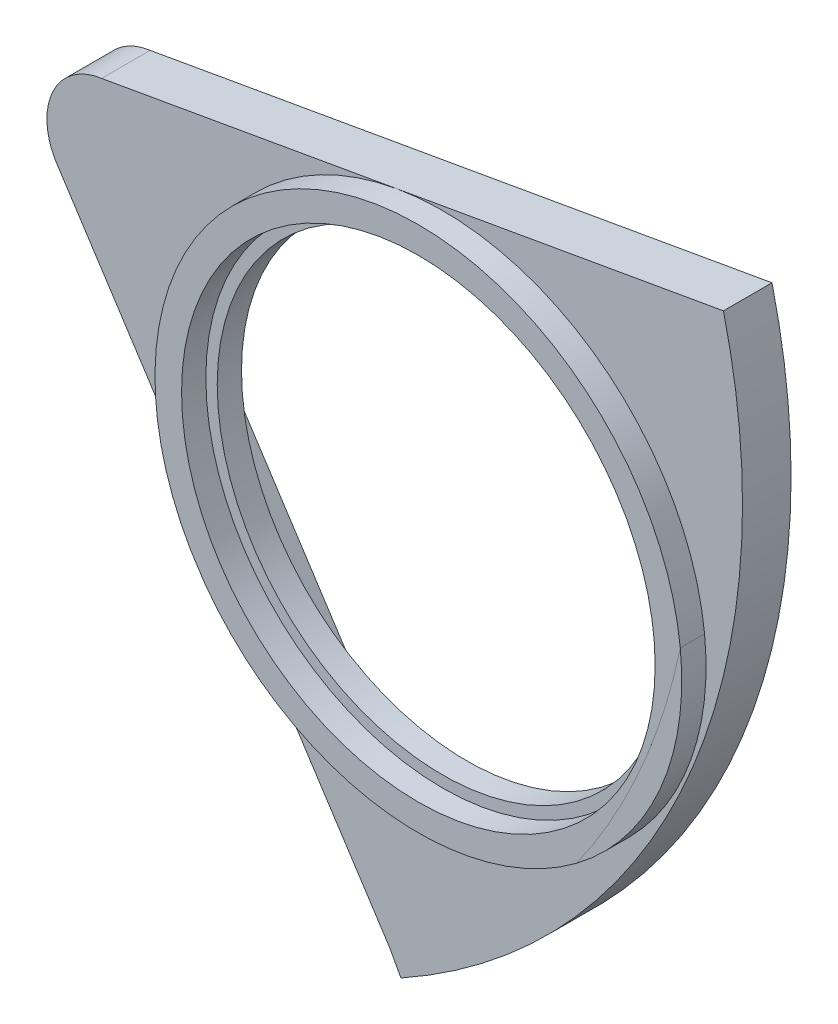
ISO-10303-21;
HEADER;
FILE_DESCRIPTION(('STEP AP214'),'2;1');
FILE_NAME('part.step','',(''),(''),'','','');
FILE_SCHEMA(('AUTOMOTIVE_DESIGN { 1 0 10303 214 1 1 1 1 }'));
ENDSEC;
DATA;
#1=APPLICATION_CONTEXT('core data for automotive mechanical design processes');
#2=APPLICATION_PROTOCOL_DEFINITION('international standard','automotive_design',2000,#1);
#3=PRODUCT_CONTEXT('',#1,'mechanical');
#4=PRODUCT('Part','Part','',(#3));
#5=PRODUCT_RELATED_PRODUCT_CATEGORY('part','',(#4));
#6=PRODUCT_DEFINITION_FORMATION('','',#4);
#7=PRODUCT_DEFINITION_CONTEXT('part definition',#1,'design');
#8=PRODUCT_DEFINITION('design','',#6,#7);
#9=PRODUCT_DEFINITION_SHAPE('','',#8);
#10=(LENGTH_UNIT() NAMED_UNIT(*) SI_UNIT(.MILLI.,.METRE.));
#11=(NAMED_UNIT(*) PLANE_ANGLE_UNIT() SI_UNIT($,.RADIAN.));
#12=(NAMED_UNIT(*) SI_UNIT($,.STERADIAN.) SOLID_ANGLE_UNIT());
#13=UNCERTAINTY_MEASURE_WITH_UNIT(LENGTH_MEASURE(1.E-05),#10,'distance_accuracy_value','');
#14=(GEOMETRIC_REPRESENTATION_CONTEXT(3) GLOBAL_UNCERTAINTY_ASSIGNED_CONTEXT((#13)) GLOBAL_UNIT_ASSIGNED_CONTEXT((#10,
#11,#12)) REPRESENTATION_CONTEXT('',''));
#15=CARTESIAN_POINT('',(0.,0.,0.));
#16=DIRECTION('',(0.,0.,1.));
#17=DIRECTION('',(1.,0.,0.));
#18=AXIS2_PLACEMENT_3D('',#15,#16,#17);
#19=CARTESIAN_POINT('',(-87.7215980924753,-33.7518162287275,0.));
#20=DIRECTION('',(0.,0.,1.));
#21=DIRECTION('',(1.,0.,0.));
#22=AXIS2_PLACEMENT_3D('',#19,#20,#21);
#23=PLANE('',#22);
#24=CARTESIAN_POINT('',(-72.6973705651812,-40.2918446449412,0.));
#25=DIRECTION('',(0.,0.,1.));
#26=DIRECTION('',(1.,0.,0.));
#27=AXIS2_PLACEMENT_3D('',#24,#25,#26);
#28=CIRCLE('',#27,9.75);
#29=CARTESIAN_POINT('',(-62.9473705651812,-40.2918446449412,0.));
#30=VERTEX_POINT('',#29);
#31=EDGE_CURVE('E213',#30,#30,#28,.F.);
#32=ORIENTED_EDGE('',*,*,#31,.F.);
#33=EDGE_LOOP('',(#32));
#34=FACE_BOUND('',#33,.T.);
#35=CARTESIAN_POINT('',(-72.6973705651812,-40.2918446449412,0.));
#36=DIRECTION('',(0.,0.,1.));
#37=DIRECTION('',(1.,0.,0.));
#38=AXIS2_PLACEMENT_3D('',#35,#36,#37);
#39=CIRCLE('',#38,9.28177922871456);
#40=CARTESIAN_POINT('',(-63.4155913364666,-40.2918446449412,0.));
#41=VERTEX_POINT('',#40);
#42=EDGE_CURVE('E238',#41,#41,#39,.T.);
#43=ORIENTED_EDGE('',*,*,#42,.F.);
#44=EDGE_LOOP('',(#43));
#45=FACE_BOUND('',#44,.T.);
#46=ADVANCED_FACE('F74',(#34,#45),#23,.T.);
#47=DIRECTION('',(-0.544638613720256,0.838670841537297,0.));
#48=VECTOR('',#47,1.);
#49=CARTESIAN_POINT('',(-74.8957008941746,-56.7935317948851,0.));
#50=LINE('',#49,#48);
#51=CARTESIAN_POINT('',(-82.083067964094,-45.725944890254,0.));
#52=VERTEX_POINT('',#51);
#53=CARTESIAN_POINT('',(-88.4878770636356,-35.8633929115997,0.));
#54=VERTEX_POINT('',#53);
#55=EDGE_CURVE('E304',#52,#54,#50,.T.);
#56=ORIENTED_EDGE('',*,*,#55,.F.);
#57=CARTESIAN_POINT('',(-72.6973705651812,-40.2918446449412,0.));
#58=DIRECTION('',(0.,0.,1.));
#59=DIRECTION('',(1.,0.,0.));
#60=AXIS2_PLACEMENT_3D('',#57,#58,#59);
#61=CIRCLE('',#60,10.8453105598718);
#62=CARTESIAN_POINT('',(-74.5806378395699,-29.611298520642,0.));
#63=VERTEX_POINT('',#62);
#64=EDGE_CURVE('E217',#63,#52,#61,.T.);
#65=ORIENTED_EDGE('',*,*,#64,.F.);
#66=DIRECTION('',(-0.98480777155592,-0.173648072500284,0.));
#67=VECTOR('',#66,1.);
#68=CARTESIAN_POINT('',(-62.121245037422,-27.4143727782723,0.));
#69=LINE('',#68,#67);
#70=CARTESIAN_POINT('',(-86.7414351925949,-31.7555738618926,0.));
#71=VERTEX_POINT('',#70);
#72=EDGE_CURVE('E297',#63,#71,#69,.T.);
#73=ORIENTED_EDGE('',*,*,#72,.T.);
#74=CARTESIAN_POINT('',(-86.3971984445816,-34.3270862920871,0.));
#75=DIRECTION('',(0.,0.,-1.));
#76=DIRECTION('',(-1.,0.,0.));
#77=AXIS2_PLACEMENT_3D('',#74,#75,#76);
#78=CIRCLE('',#77,2.59445083154944);
#79=EDGE_CURVE('E301',#54,#71,#78,.T.);
#80=ORIENTED_EDGE('',*,*,#79,.F.);
#81=EDGE_LOOP('',(#56,#65,#73,#80));
#82=FACE_BOUND('',#81,.T.);
#83=ADVANCED_FACE('F340',(#82),#23,.T.);
#84=CARTESIAN_POINT('',(-61.136437265866,-27.240724705772,0.));
#85=VERTEX_POINT('',#84);
#86=EDGE_CURVE('E298',#85,#63,#69,.T.);
#87=ORIENTED_EDGE('',*,*,#86,.T.);
#88=CARTESIAN_POINT('',(-61.9127981955829,-39.1456509680415,0.));
#89=VERTEX_POINT('',#88);
#90=EDGE_CURVE('E218',#89,#63,#61,.T.);
#91=ORIENTED_EDGE('',*,*,#90,.F.);
#92=CARTESIAN_POINT('',(-87.4793706907652,-33.8551480186694,0.));
#93=DIRECTION('',(0.,0.,1.));
#94=DIRECTION('',(1.,0.,0.));
#95=AXIS2_PLACEMENT_3D('',#92,#93,#94);
#96=CIRCLE('',#95,26.1082180665155);
#97=CARTESIAN_POINT('',(-66.1897581992972,-48.9677735540242,0.));
#98=VERTEX_POINT('',#97);
#99=EDGE_CURVE('E192',#89,#98,#96,.F.);
#100=ORIENTED_EDGE('',*,*,#99,.T.);
#101=CARTESIAN_POINT('',(-81.4791816073663,-46.6558493557677,0.));
#102=VERTEX_POINT('',#101);
#103=EDGE_CURVE('E209',#102,#98,#61,.T.);
#104=ORIENTED_EDGE('',*,*,#103,.F.);
#105=CARTESIAN_POINT('',(-74.8957008941746,-56.7935317948851,0.));
#106=VERTEX_POINT('',#105);
#107=EDGE_CURVE('E305',#106,#102,#50,.T.);
#108=ORIENTED_EDGE('',*,*,#107,.F.);
#109=DIRECTION('',(0.480966485492618,-0.876738980445651,0.));
#110=VECTOR('',#109,1.);
#111=CARTESIAN_POINT('',(-74.8957008941746,-56.7935317948851,0.));
#112=LINE('',#111,#110);
#113=CARTESIAN_POINT('',(-74.414734408682,-57.6702707753307,0.));
#114=VERTEX_POINT('',#113);
#115=EDGE_CURVE('E291',#106,#114,#112,.T.);
#116=ORIENTED_EDGE('',*,*,#115,.T.);
#117=CARTESIAN_POINT('',(-87.7215980924753,-33.7518162287275,0.));
#118=DIRECTION('',(0.,0.,1.));
#119=DIRECTION('',(1.,0.,0.));
#120=AXIS2_PLACEMENT_3D('',#117,#118,#119);
#121=CIRCLE('',#120,27.3708803109615);
#122=EDGE_CURVE('E294',#114,#85,#121,.T.);
#123=ORIENTED_EDGE('',*,*,#122,.T.);
#124=EDGE_LOOP('',(#87,#91,#100,#104,#108,#116,#123));
#125=FACE_BOUND('',#124,.T.);
#126=CARTESIAN_POINT('',(-87.479157811208,-33.8552405815905,0.));
#127=DIRECTION('',(0.,0.,1.));
#128=DIRECTION('',(1.,0.,0.));
#129=AXIS2_PLACEMENT_3D('',#126,#127,#128);
#130=CIRCLE('',#129,26.1080292308289);
#131=CARTESIAN_POINT('',(-66.1896576526265,-48.967698135396,0.));
#132=VERTEX_POINT('',#131);
#133=CARTESIAN_POINT('',(-61.9127848954104,-39.145776116693,0.));
#134=VERTEX_POINT('',#133);
#135=EDGE_CURVE('E99',#132,#134,#130,.T.);
#136=ORIENTED_EDGE('',*,*,#135,.T.);
#137=CARTESIAN_POINT('',(-72.6973705651812,-40.2918446449412,0.));
#138=DIRECTION('',(0.,0.,1.));
#139=DIRECTION('',(1.,0.,0.));
#140=AXIS2_PLACEMENT_3D('',#137,#138,#139);
#141=CIRCLE('',#140,10.8453105598718);
#142=EDGE_CURVE('E229',#132,#134,#141,.T.);
#143=ORIENTED_EDGE('',*,*,#142,.F.);
#144=EDGE_LOOP('',(#136,#143));
#145=FACE_BOUND('',#144,.T.);
#146=ADVANCED_FACE('F323',(#125,#145),#23,.T.);
#147=CARTESIAN_POINT('',(-87.7215980924753,-33.7518162287275,-1.));
#148=DIRECTION('',(0.,0.,1.));
#149=DIRECTION('',(1.,0.,0.));
#150=AXIS2_PLACEMENT_3D('',#147,#148,#149);
#151=PLANE('',#150);
#152=DIRECTION('',(-0.98480777155592,-0.173648072500283,0.));
#153=VECTOR('',#152,1.);
#154=CARTESIAN_POINT('',(-87.8597718778153,-32.9681932626394,-1.));
#155=LINE('',#154,#153);
#156=CARTESIAN_POINT('',(-61.9475969649217,-28.3991805498282,-1.));
#157=VERTEX_POINT('',#156);
#158=CARTESIAN_POINT('',(-86.5677871200946,-32.7403816334485,-1.));
#159=VERTEX_POINT('',#158);
#160=EDGE_CURVE('E288',#157,#159,#155,.T.);
#161=ORIENTED_EDGE('',*,*,#160,.F.);
#162=CARTESIAN_POINT('',(-87.479157811208,-33.8552405815905,-1.));
#163=DIRECTION('',(0.,0.,1.));
#164=DIRECTION('',(1.,0.,0.));
#165=AXIS2_PLACEMENT_3D('',#162,#163,#164);
#166=CIRCLE('',#165,26.1080292308289);
#167=CARTESIAN_POINT('',(-74.0570300526373,-56.2488931811648,-1.));
#168=VERTEX_POINT('',#167);
#169=EDGE_CURVE('E272',#168,#157,#166,.T.);
#170=ORIENTED_EDGE('',*,*,#169,.F.);
#171=DIRECTION('',(0.544638613720256,-0.838670841537297,0.));
#172=VECTOR('',#171,1.);
#173=CARTESIAN_POINT('',(-88.3864141684796,-34.1835523617618,-1.));
#174=LINE('',#173,#172);
#175=CARTESIAN_POINT('',(-87.6492062220983,-35.3187542978794,-1.));
#176=VERTEX_POINT('',#175);
#177=EDGE_CURVE('E283',#176,#168,#174,.T.);
#178=ORIENTED_EDGE('',*,*,#177,.F.);
#179=CARTESIAN_POINT('',(-86.3809148382952,-34.3347297846347,-1.));
#180=DIRECTION('',(0.,0.,1.));
#181=DIRECTION('',(1.,0.,0.));
#182=AXIS2_PLACEMENT_3D('',#179,#180,#181);
#183=CIRCLE('',#182,1.60526237011135);
#184=EDGE_CURVE('E286',#176,#159,#183,.F.);
#185=ORIENTED_EDGE('',*,*,#184,.T.);
#186=EDGE_LOOP('',(#161,#170,#178,#185));
#187=FACE_BOUND('',#186,.T.);
#188=CARTESIAN_POINT('',(-72.6973705651812,-40.2918446449412,-1.));
#189=DIRECTION('',(0.,0.,1.));
#190=DIRECTION('',(1.,0.,0.));
#191=AXIS2_PLACEMENT_3D('',#188,#189,#190);
#192=CIRCLE('',#191,9.28177922871456);
#193=CARTESIAN_POINT('',(-63.4155913364666,-40.2918446449412,-1.));
#194=VERTEX_POINT('',#193);
#195=EDGE_CURVE('E239',#194,#194,#192,.T.);
#196=ORIENTED_EDGE('',*,*,#195,.T.);
#197=EDGE_LOOP('',(#196));
#198=FACE_BOUND('',#197,.T.);
#199=ADVANCED_FACE('F368',(#187,#198),#151,.F.);
#200=CARTESIAN_POINT('',(-74.8957008941746,-56.7935317948851,-1.));
#201=DIRECTION('',(-0.876738980445651,-0.480966485492618,0.));
#202=DIRECTION('',(0.480966485492618,-0.876738980445651,0.));
#203=AXIS2_PLACEMENT_3D('',#200,#201,#202);
#204=PLANE('',#203);
#205=ORIENTED_EDGE('',*,*,#115,.F.);
#206=DIRECTION('',(0.,0.,1.));
#207=VECTOR('',#206,1.);
#208=CARTESIAN_POINT('',(-74.8957008941746,-56.7935317948851,-1.));
#209=LINE('',#208,#207);
#210=CARTESIAN_POINT('',(-74.8957008941746,-56.7935317948851,-2.));
#211=VERTEX_POINT('',#210);
#212=EDGE_CURVE('E12',#211,#106,#209,.T.);
#213=ORIENTED_EDGE('',*,*,#212,.F.);
#214=DIRECTION('',(0.480966485492618,-0.876738980445651,0.));
#215=VECTOR('',#214,1.);
#216=CARTESIAN_POINT('',(-81.5189850939584,-44.7201511921333,-2.));
#217=LINE('',#216,#215);
#218=CARTESIAN_POINT('',(-74.414734408682,-57.6702707753307,-2.));
#219=VERTEX_POINT('',#218);
#220=EDGE_CURVE('E256',#211,#219,#217,.T.);
#221=ORIENTED_EDGE('',*,*,#220,.T.);
#222=DIRECTION('',(0.,0.,1.));
#223=VECTOR('',#222,1.);
#224=CARTESIAN_POINT('',(-74.414734408682,-57.6702707753307,-1.));
#225=LINE('',#224,#223);
#226=EDGE_CURVE('E78',#219,#114,#225,.T.);
#227=ORIENTED_EDGE('',*,*,#226,.T.);
#228=EDGE_LOOP('',(#205,#213,#221,#227));
#229=FACE_BOUND('',#228,.T.);
#230=ADVANCED_FACE('F76',(#229),#204,.T.);
#231=CARTESIAN_POINT('',(-74.8957008941746,-56.7935317948851,-1.));
#232=DIRECTION('',(0.838670841537297,0.544638613720256,0.));
#233=DIRECTION('',(-0.544638613720256,0.838670841537297,0.));
#234=AXIS2_PLACEMENT_3D('',#231,#232,#233);
#235=PLANE('',#234);
#236=ORIENTED_EDGE('',*,*,#107,.T.);
#237=DIRECTION('',(0.,0.,-1.));
#238=VECTOR('',#237,1.);
#239=CARTESIAN_POINT('',(-81.4791816073663,-46.6558493557677,1.));
#240=LINE('',#239,#238);
#241=CARTESIAN_POINT('',(-81.4791816073663,-46.6558493557677,1.));
#242=VERTEX_POINT('',#241);
#243=EDGE_CURVE('E222',#242,#102,#240,.T.);
#244=ORIENTED_EDGE('',*,*,#243,.F.);
#245=DIRECTION('',(-0.544638613720256,0.838670841537297,0.));
#246=VECTOR('',#245,1.);
#247=CARTESIAN_POINT('',(-78.6210226918611,-51.0570329709737,1.));
#248=LINE('',#247,#246);
#249=CARTESIAN_POINT('',(-82.083067964094,-45.725944890254,1.));
#250=VERTEX_POINT('',#249);
#251=EDGE_CURVE('E200',#242,#250,#248,.T.);
#252=ORIENTED_EDGE('',*,*,#251,.T.);
#253=DIRECTION('',(0.,0.,-1.));
#254=VECTOR('',#253,1.);
#255=CARTESIAN_POINT('',(-82.083067964094,-45.725944890254,1.));
#256=LINE('',#255,#254);
#257=EDGE_CURVE('E91',#250,#52,#256,.T.);
#258=ORIENTED_EDGE('',*,*,#257,.T.);
#259=ORIENTED_EDGE('',*,*,#55,.T.);
#260=DIRECTION('',(0.,0.,1.));
#261=VECTOR('',#260,1.);
#262=CARTESIAN_POINT('',(-88.4878770636356,-35.8633929115997,-1.));
#263=LINE('',#262,#261);
#264=CARTESIAN_POINT('',(-88.4878770636356,-35.8633929115997,-2.));
#265=VERTEX_POINT('',#264);
#266=EDGE_CURVE('E83',#265,#54,#263,.T.);
#267=ORIENTED_EDGE('',*,*,#266,.F.);
#268=DIRECTION('',(-0.544638613720256,0.838670841537297,0.));
#269=VECTOR('',#268,1.);
#270=CARTESIAN_POINT('',(-78.6210226918611,-51.0570329709737,-2.));
#271=LINE('',#270,#269);
#272=EDGE_CURVE('E253',#211,#265,#271,.T.);
#273=ORIENTED_EDGE('',*,*,#272,.F.);
#274=ORIENTED_EDGE('',*,*,#212,.T.);
#275=EDGE_LOOP('',(#236,#244,#252,#258,#259,#267,#273,#274));
#276=FACE_BOUND('',#275,.T.);
#277=ADVANCED_FACE('F327',(#276),#235,.F.);
#278=CARTESIAN_POINT('',(-86.3971984445816,-34.3270862920871,-1.));
#279=DIRECTION('',(0.,0.,1.));
#280=DIRECTION('',(1.,0.,0.));
#281=AXIS2_PLACEMENT_3D('',#278,#279,#280);
#282=CYLINDRICAL_SURFACE('',#281,2.59445083154944);
#283=ORIENTED_EDGE('',*,*,#79,.T.);
#284=DIRECTION('',(0.,0.,1.));
#285=VECTOR('',#284,1.);
#286=CARTESIAN_POINT('',(-86.7414351925949,-31.7555738618926,-1.));
#287=LINE('',#286,#285);
#288=CARTESIAN_POINT('',(-86.7414351925949,-31.7555738618926,-2.));
#289=VERTEX_POINT('',#288);
#290=EDGE_CURVE('E310',#289,#71,#287,.T.);
#291=ORIENTED_EDGE('',*,*,#290,.F.);
#292=CARTESIAN_POINT('',(-86.3971984445816,-34.3270862920871,-2.));
#293=DIRECTION('',(0.,0.,1.));
#294=DIRECTION('',(1.,0.,0.));
#295=AXIS2_PLACEMENT_3D('',#292,#293,#294);
#296=CIRCLE('',#295,2.59445083154944);
#297=EDGE_CURVE('E250',#265,#289,#296,.F.);
#298=ORIENTED_EDGE('',*,*,#297,.F.);
#299=ORIENTED_EDGE('',*,*,#266,.T.);
#300=EDGE_LOOP('',(#283,#291,#298,#299));
#301=FACE_BOUND('',#300,.T.);
#302=ADVANCED_FACE('F472',(#301),#282,.T.);
#303=CARTESIAN_POINT('',(-62.121245037422,-27.4143727782723,-1.));
#304=DIRECTION('',(-0.173648072500284,0.984807771555919,0.));
#305=DIRECTION('',(-0.98480777155592,-0.173648072500284,0.));
#306=AXIS2_PLACEMENT_3D('',#303,#304,#305);
#307=PLANE('',#306);
#308=ORIENTED_EDGE('',*,*,#86,.F.);
#309=DIRECTION('',(0.,0.,1.));
#310=VECTOR('',#309,1.);
#311=CARTESIAN_POINT('',(-61.136437265866,-27.240724705772,-1.));
#312=LINE('',#311,#310);
#313=CARTESIAN_POINT('',(-61.136437265866,-27.240724705772,-2.));
#314=VERTEX_POINT('',#313);
#315=EDGE_CURVE('E312',#314,#85,#312,.T.);
#316=ORIENTED_EDGE('',*,*,#315,.F.);
#317=DIRECTION('',(-0.98480777155592,-0.173648072500284,0.));
#318=VECTOR('',#317,1.);
#319=CARTESIAN_POINT('',(2.81494863045683,-15.9643769601879,-2.));
#320=LINE('',#319,#318);
#321=EDGE_CURVE('E247',#314,#289,#320,.T.);
#322=ORIENTED_EDGE('',*,*,#321,.T.);
#323=ORIENTED_EDGE('',*,*,#290,.T.);
#324=ORIENTED_EDGE('',*,*,#72,.F.);
#325=EDGE_LOOP('',(#308,#316,#322,#323,#324));
#326=FACE_BOUND('',#325,.T.);
#327=ADVANCED_FACE('F335',(#326),#307,.T.);
#328=CARTESIAN_POINT('',(-87.7215980924753,-33.7518162287275,-1.));
#329=DIRECTION('',(0.,0.,1.));
#330=DIRECTION('',(1.,0.,0.));
#331=AXIS2_PLACEMENT_3D('',#328,#329,#330);
#332=CYLINDRICAL_SURFACE('',#331,27.3708803109615);
#333=ORIENTED_EDGE('',*,*,#122,.F.);
#334=ORIENTED_EDGE('',*,*,#226,.F.);
#335=CARTESIAN_POINT('',(-87.7215980924753,-33.7518162287275,-2.));
#336=DIRECTION('',(0.,0.,1.));
#337=DIRECTION('',(1.,0.,0.));
#338=AXIS2_PLACEMENT_3D('',#335,#336,#337);
#339=CIRCLE('',#338,27.3708803109615);
#340=EDGE_CURVE('E242',#219,#314,#339,.T.);
#341=ORIENTED_EDGE('',*,*,#340,.T.);
#342=ORIENTED_EDGE('',*,*,#315,.T.);
#343=EDGE_LOOP('',(#333,#334,#341,#342));
#344=FACE_BOUND('',#343,.T.);
#345=ADVANCED_FACE('F320',(#344),#332,.T.);
#346=CARTESIAN_POINT('',(2.98859670295711,-16.9491847317439,-2.));
#347=DIRECTION('',(-0.173648072500283,0.98480777155592,0.));
#348=DIRECTION('',(-0.98480777155592,-0.173648072500283,0.));
#349=AXIS2_PLACEMENT_3D('',#346,#347,#348);
#350=PLANE('',#349);
#351=DIRECTION('',(0.,0.,1.));
#352=VECTOR('',#351,1.);
#353=CARTESIAN_POINT('',(-61.9475969649217,-28.3991805498282,-2.));
#354=LINE('',#353,#352);
#355=CARTESIAN_POINT('',(-61.9475969649217,-28.3991805498282,-2.));
#356=VERTEX_POINT('',#355);
#357=EDGE_CURVE('E268',#356,#157,#354,.T.);
#358=ORIENTED_EDGE('',*,*,#357,.T.);
#359=ORIENTED_EDGE('',*,*,#160,.T.);
#360=DIRECTION('',(0.,0.,1.));
#361=VECTOR('',#360,1.);
#362=CARTESIAN_POINT('',(-86.5677871200946,-32.7403816334485,-2.));
#363=LINE('',#362,#361);
#364=CARTESIAN_POINT('',(-86.5677871200946,-32.7403816334485,-2.));
#365=VERTEX_POINT('',#364);
#366=EDGE_CURVE('E269',#365,#159,#363,.T.);
#367=ORIENTED_EDGE('',*,*,#366,.F.);
#368=DIRECTION('',(-0.98480777155592,-0.173648072500283,0.));
#369=VECTOR('',#368,1.);
#370=CARTESIAN_POINT('',(2.98859670295711,-16.9491847317439,-2.));
#371=LINE('',#370,#369);
#372=EDGE_CURVE('E259',#356,#365,#371,.T.);
#373=ORIENTED_EDGE('',*,*,#372,.F.);
#374=EDGE_LOOP('',(#358,#359,#367,#373));
#375=FACE_BOUND('',#374,.T.);
#376=ADVANCED_FACE('F378',(#375),#350,.F.);
#377=CARTESIAN_POINT('',(-86.3809148382952,-34.3347297846347,-2.));
#378=DIRECTION('',(0.,0.,1.));
#379=DIRECTION('',(1.,0.,0.));
#380=AXIS2_PLACEMENT_3D('',#377,#378,#379);
#381=CYLINDRICAL_SURFACE('',#380,1.60526237011135);
#382=ORIENTED_EDGE('',*,*,#184,.F.);
#383=DIRECTION('',(0.,0.,1.));
#384=VECTOR('',#383,1.);
#385=CARTESIAN_POINT('',(-87.6492062220983,-35.3187542978794,-2.));
#386=LINE('',#385,#384);
#387=CARTESIAN_POINT('',(-87.6492062220983,-35.3187542978794,-2.));
#388=VERTEX_POINT('',#387);
#389=EDGE_CURVE('E273',#388,#176,#386,.T.);
#390=ORIENTED_EDGE('',*,*,#389,.F.);
#391=CARTESIAN_POINT('',(-86.3809148382952,-34.3347297846347,-2.));
#392=DIRECTION('',(0.,0.,1.));
#393=DIRECTION('',(1.,0.,0.));
#394=AXIS2_PLACEMENT_3D('',#391,#392,#393);
#395=CIRCLE('',#394,1.60526237011135);
#396=EDGE_CURVE('E265',#388,#365,#395,.F.);
#397=ORIENTED_EDGE('',*,*,#396,.T.);
#398=ORIENTED_EDGE('',*,*,#366,.T.);
#399=EDGE_LOOP('',(#382,#390,#397,#398));
#400=FACE_BOUND('',#399,.T.);
#401=ADVANCED_FACE('F381',(#400),#381,.F.);
#402=CARTESIAN_POINT('',(-77.7823518503238,-50.5123943572534,-2.));
#403=DIRECTION('',(-0.838670841537297,-0.544638613720256,0.));
#404=DIRECTION('',(0.544638613720256,-0.838670841537297,0.));
#405=AXIS2_PLACEMENT_3D('',#402,#403,#404);
#406=PLANE('',#405);
#407=ORIENTED_EDGE('',*,*,#389,.T.);
#408=ORIENTED_EDGE('',*,*,#177,.T.);
#409=DIRECTION('',(0.,0.,1.));
#410=VECTOR('',#409,1.);
#411=CARTESIAN_POINT('',(-74.0570300526373,-56.2488931811648,-2.));
#412=LINE('',#411,#410);
#413=CARTESIAN_POINT('',(-74.0570300526373,-56.2488931811648,-2.));
#414=VERTEX_POINT('',#413);
#415=EDGE_CURVE('E276',#414,#168,#412,.T.);
#416=ORIENTED_EDGE('',*,*,#415,.F.);
#417=DIRECTION('',(0.544638613720256,-0.838670841537297,0.));
#418=VECTOR('',#417,1.);
#419=CARTESIAN_POINT('',(-77.7823518503238,-50.5123943572534,-2.));
#420=LINE('',#419,#418);
#421=EDGE_CURVE('E263',#388,#414,#420,.T.);
#422=ORIENTED_EDGE('',*,*,#421,.F.);
#423=EDGE_LOOP('',(#407,#408,#416,#422));
#424=FACE_BOUND('',#423,.T.);
#425=ADVANCED_FACE('F386',(#424),#406,.F.);
#426=CARTESIAN_POINT('',(-87.479157811208,-33.8552405815905,-2.));
#427=DIRECTION('',(0.,0.,1.));
#428=DIRECTION('',(1.,0.,0.));
#429=AXIS2_PLACEMENT_3D('',#426,#427,#428);
#430=CYLINDRICAL_SURFACE('',#429,26.1080292308289);
#431=ORIENTED_EDGE('',*,*,#415,.T.);
#432=ORIENTED_EDGE('',*,*,#169,.T.);
#433=ORIENTED_EDGE('',*,*,#357,.F.);
#434=CARTESIAN_POINT('',(-87.479157811208,-33.8552405815905,-2.));
#435=DIRECTION('',(0.,0.,1.));
#436=DIRECTION('',(1.,0.,0.));
#437=AXIS2_PLACEMENT_3D('',#434,#435,#436);
#438=CIRCLE('',#437,26.1080292308289);
#439=EDGE_CURVE('E261',#414,#356,#438,.T.);
#440=ORIENTED_EDGE('',*,*,#439,.F.);
#441=EDGE_LOOP('',(#431,#432,#433,#440));
#442=FACE_BOUND('',#441,.T.);
#443=ADVANCED_FACE('F383',(#442),#430,.F.);
#444=CARTESIAN_POINT('',(0.,0.,-2.));
#445=DIRECTION('',(0.,0.,1.));
#446=DIRECTION('',(1.,0.,0.));
#447=AXIS2_PLACEMENT_3D('',#444,#445,#446);
#448=PLANE('',#447);
#449=ORIENTED_EDGE('',*,*,#340,.F.);
#450=ORIENTED_EDGE('',*,*,#220,.F.);
#451=ORIENTED_EDGE('',*,*,#272,.T.);
#452=ORIENTED_EDGE('',*,*,#297,.T.);
#453=ORIENTED_EDGE('',*,*,#321,.F.);
#454=EDGE_LOOP('',(#449,#450,#451,#452,#453));
#455=FACE_BOUND('',#454,.T.);
#456=ORIENTED_EDGE('',*,*,#372,.T.);
#457=ORIENTED_EDGE('',*,*,#396,.F.);
#458=ORIENTED_EDGE('',*,*,#421,.T.);
#459=ORIENTED_EDGE('',*,*,#439,.T.);
#460=EDGE_LOOP('',(#456,#457,#458,#459));
#461=FACE_BOUND('',#460,.T.);
#462=ADVANCED_FACE('F331',(#455,#461),#448,.F.);
#463=CARTESIAN_POINT('',(-72.6973705651812,-40.2918446449412,-1.));
#464=DIRECTION('',(0.,0.,1.));
#465=DIRECTION('',(1.,0.,0.));
#466=AXIS2_PLACEMENT_3D('',#463,#464,#465);
#467=CYLINDRICAL_SURFACE('',#466,9.28177922871456);
#468=ORIENTED_EDGE('',*,*,#195,.F.);
#469=EDGE_LOOP('',(#468));
#470=FACE_BOUND('',#469,.T.);
#471=ORIENTED_EDGE('',*,*,#42,.T.);
#472=EDGE_LOOP('',(#471));
#473=FACE_BOUND('',#472,.T.);
#474=ADVANCED_FACE('F396',(#470,#473),#467,.F.);
#475=CARTESIAN_POINT('',(-87.479157811208,-33.8552405815905,1.));
#476=DIRECTION('',(0.,0.,-1.));
#477=DIRECTION('',(-1.,0.,0.));
#478=AXIS2_PLACEMENT_3D('',#475,#476,#477);
#479=CYLINDRICAL_SURFACE('',#478,26.1080292308289);
#480=ORIENTED_EDGE('',*,*,#135,.F.);
#481=DIRECTION('',(0.,0.,-1.));
#482=VECTOR('',#481,1.);
#483=CARTESIAN_POINT('',(-66.1896576526265,-48.967698135396,1.));
#484=LINE('',#483,#482);
#485=CARTESIAN_POINT('',(-66.1896576526265,-48.967698135396,1.));
#486=VERTEX_POINT('',#485);
#487=EDGE_CURVE('E236',#486,#132,#484,.T.);
#488=ORIENTED_EDGE('',*,*,#487,.F.);
#489=CARTESIAN_POINT('',(-87.479157811208,-33.8552405815905,1.));
#490=DIRECTION('',(0.,0.,1.));
#491=DIRECTION('',(1.,0.,0.));
#492=AXIS2_PLACEMENT_3D('',#489,#490,#491);
#493=CIRCLE('',#492,26.1080292308289);
#494=CARTESIAN_POINT('',(-61.9127848954104,-39.145776116693,1.));
#495=VERTEX_POINT('',#494);
#496=EDGE_CURVE('E225',#486,#495,#493,.T.);
#497=ORIENTED_EDGE('',*,*,#496,.T.);
#498=DIRECTION('',(0.,0.,-1.));
#499=VECTOR('',#498,1.);
#500=CARTESIAN_POINT('',(-61.9127848954104,-39.145776116693,1.));
#501=LINE('',#500,#499);
#502=EDGE_CURVE('E231',#495,#134,#501,.T.);
#503=ORIENTED_EDGE('',*,*,#502,.T.);
#504=EDGE_LOOP('',(#480,#488,#497,#503));
#505=FACE_BOUND('',#504,.T.);
#506=ADVANCED_FACE('F399',(#505),#479,.F.);
#507=CARTESIAN_POINT('',(-72.6973705651812,-40.2918446449412,1.));
#508=DIRECTION('',(0.,0.,-1.));
#509=DIRECTION('',(-1.,0.,0.));
#510=AXIS2_PLACEMENT_3D('',#507,#508,#509);
#511=CYLINDRICAL_SURFACE('',#510,10.8453105598718);
#512=ORIENTED_EDGE('',*,*,#142,.T.);
#513=ORIENTED_EDGE('',*,*,#502,.F.);
#514=CARTESIAN_POINT('',(-72.6973705651812,-40.2918446449412,1.));
#515=DIRECTION('',(0.,0.,1.));
#516=DIRECTION('',(1.,0.,0.));
#517=AXIS2_PLACEMENT_3D('',#514,#515,#516);
#518=CIRCLE('',#517,10.8453105598718);
#519=EDGE_CURVE('E228',#486,#495,#518,.T.);
#520=ORIENTED_EDGE('',*,*,#519,.F.);
#521=ORIENTED_EDGE('',*,*,#487,.T.);
#522=EDGE_LOOP('',(#512,#513,#520,#521));
#523=FACE_BOUND('',#522,.T.);
#524=ADVANCED_FACE('F403',(#523),#511,.T.);
#525=CARTESIAN_POINT('',(0.,0.,1.));
#526=DIRECTION('',(0.,0.,1.));
#527=DIRECTION('',(1.,0.,0.));
#528=AXIS2_PLACEMENT_3D('',#525,#526,#527);
#529=PLANE('',#528);
#530=ORIENTED_EDGE('',*,*,#496,.F.);
#531=ORIENTED_EDGE('',*,*,#519,.T.);
#532=EDGE_LOOP('',(#530,#531));
#533=FACE_BOUND('',#532,.T.);
#534=ADVANCED_FACE('F406',(#533),#529,.T.);
#535=CARTESIAN_POINT('',(-87.4793706907652,-33.8551480186694,1.));
#536=DIRECTION('',(0.,0.,-1.));
#537=DIRECTION('',(-1.,0.,0.));
#538=AXIS2_PLACEMENT_3D('',#535,#536,#537);
#539=CYLINDRICAL_SURFACE('',#538,26.1082180665155);
#540=ORIENTED_EDGE('',*,*,#99,.F.);
#541=DIRECTION('',(0.,0.,-1.));
#542=VECTOR('',#541,1.);
#543=CARTESIAN_POINT('',(-61.9127981955829,-39.1456509680415,1.));
#544=LINE('',#543,#542);
#545=CARTESIAN_POINT('',(-61.9127981955829,-39.1456509680415,1.));
#546=VERTEX_POINT('',#545);
#547=EDGE_CURVE('E186',#546,#89,#544,.T.);
#548=ORIENTED_EDGE('',*,*,#547,.F.);
#549=CARTESIAN_POINT('',(-87.4793706907652,-33.8551480186694,1.));
#550=DIRECTION('',(0.,0.,1.));
#551=DIRECTION('',(1.,0.,0.));
#552=AXIS2_PLACEMENT_3D('',#549,#550,#551);
#553=CIRCLE('',#552,26.1082180665155);
#554=CARTESIAN_POINT('',(-66.1897581992972,-48.9677735540242,1.));
#555=VERTEX_POINT('',#554);
#556=EDGE_CURVE('E190',#546,#555,#553,.F.);
#557=ORIENTED_EDGE('',*,*,#556,.T.);
#558=DIRECTION('',(0.,0.,-1.));
#559=VECTOR('',#558,1.);
#560=CARTESIAN_POINT('',(-66.1897581992972,-48.9677735540242,1.));
#561=LINE('',#560,#559);
#562=EDGE_CURVE('E220',#555,#98,#561,.T.);
#563=ORIENTED_EDGE('',*,*,#562,.T.);
#564=EDGE_LOOP('',(#540,#548,#557,#563));
#565=FACE_BOUND('',#564,.T.);
#566=ADVANCED_FACE('F188',(#565),#539,.T.);
#567=CARTESIAN_POINT('',(-72.6973705651812,-40.2918446449412,1.));
#568=DIRECTION('',(0.,0.,-1.));
#569=DIRECTION('',(-1.,0.,0.));
#570=AXIS2_PLACEMENT_3D('',#567,#568,#569);
#571=CYLINDRICAL_SURFACE('',#570,10.8453105598718);
#572=ORIENTED_EDGE('',*,*,#90,.T.);
#573=ORIENTED_EDGE('',*,*,#64,.T.);
#574=ORIENTED_EDGE('',*,*,#257,.F.);
#575=CARTESIAN_POINT('',(-72.6973705651812,-40.2918446449412,1.));
#576=DIRECTION('',(0.,0.,1.));
#577=DIRECTION('',(1.,0.,0.));
#578=AXIS2_PLACEMENT_3D('',#575,#576,#577);
#579=CIRCLE('',#578,10.8453105598718);
#580=EDGE_CURVE('E196',#546,#250,#579,.T.);
#581=ORIENTED_EDGE('',*,*,#580,.F.);
#582=ORIENTED_EDGE('',*,*,#547,.T.);
#583=EDGE_LOOP('',(#572,#573,#574,#581,#582));
#584=FACE_BOUND('',#583,.T.);
#585=ADVANCED_FACE('F197',(#584),#571,.T.);
#586=CARTESIAN_POINT('',(-72.6973705651812,-40.2918446449412,1.));
#587=DIRECTION('',(0.,0.,-1.));
#588=DIRECTION('',(-1.,0.,0.));
#589=AXIS2_PLACEMENT_3D('',#586,#587,#588);
#590=CYLINDRICAL_SURFACE('',#589,9.75);
#591=CARTESIAN_POINT('',(-72.6973705651812,-40.2918446449412,1.));
#592=DIRECTION('',(0.,0.,1.));
#593=DIRECTION('',(1.,0.,0.));
#594=AXIS2_PLACEMENT_3D('',#591,#592,#593);
#595=CIRCLE('',#594,9.75);
#596=CARTESIAN_POINT('',(-62.9473705651812,-40.2918446449412,1.));
#597=VERTEX_POINT('',#596);
#598=EDGE_CURVE('E206',#597,#597,#595,.F.);
#599=ORIENTED_EDGE('',*,*,#598,.F.);
#600=EDGE_LOOP('',(#599));
#601=FACE_BOUND('',#600,.T.);
#602=ORIENTED_EDGE('',*,*,#31,.T.);
#603=EDGE_LOOP('',(#602));
#604=FACE_BOUND('',#603,.T.);
#605=ADVANCED_FACE('F345',(#601,#604),#590,.F.);
#606=ORIENTED_EDGE('',*,*,#103,.T.);
#607=ORIENTED_EDGE('',*,*,#562,.F.);
#608=EDGE_CURVE('E202',#242,#555,#579,.T.);
#609=ORIENTED_EDGE('',*,*,#608,.F.);
#610=ORIENTED_EDGE('',*,*,#243,.T.);
#611=EDGE_LOOP('',(#606,#607,#609,#610));
#612=FACE_BOUND('',#611,.T.);
#613=ADVANCED_FACE('F343',(#612),#571,.T.);
#614=CARTESIAN_POINT('',(0.,0.,1.));
#615=DIRECTION('',(0.,0.,1.));
#616=DIRECTION('',(1.,0.,0.));
#617=AXIS2_PLACEMENT_3D('',#614,#615,#616);
#618=PLANE('',#617);
#619=ORIENTED_EDGE('',*,*,#598,.T.);
#620=EDGE_LOOP('',(#619));
#621=FACE_BOUND('',#620,.T.);
#622=ORIENTED_EDGE('',*,*,#556,.F.);
#623=ORIENTED_EDGE('',*,*,#580,.T.);
#624=ORIENTED_EDGE('',*,*,#251,.F.);
#625=ORIENTED_EDGE('',*,*,#608,.T.);
#626=EDGE_LOOP('',(#622,#623,#624,#625));
#627=FACE_BOUND('',#626,.T.);
#628=ADVANCED_FACE('F203',(#621,#627),#618,.T.);
#629=CLOSED_SHELL('',(#46,#83,#146,#199,#230,#277,#302,#327,#345,#376,#401,#425,#443,#462,#474,
#506,#524,#534,#566,#585,#605,#613,#628));
#630=MANIFOLD_SOLID_BREP('B2',#629);
#631=ADVANCED_BREP_SHAPE_REPRESENTATION('',(#18,#630),#14);
#632=SHAPE_DEFINITION_REPRESENTATION(#9,#631);
ENDSEC;
END-ISO-10303-21;
